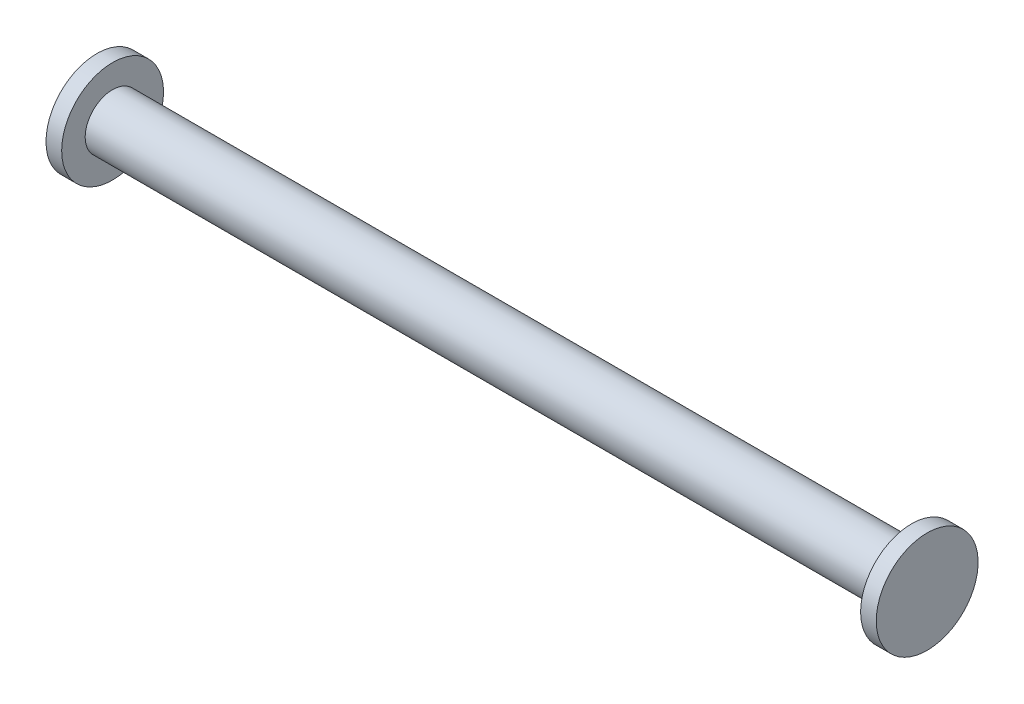
ISO-10303-21;
HEADER;
FILE_DESCRIPTION(('STEP AP214'),'2;1');
FILE_NAME('part.step','',(''),(''),'','','');
FILE_SCHEMA(('AUTOMOTIVE_DESIGN { 1 0 10303 214 1 1 1 1 }'));
ENDSEC;
DATA;
#1=APPLICATION_CONTEXT('core data for automotive mechanical design processes');
#2=APPLICATION_PROTOCOL_DEFINITION('international standard','automotive_design',2000,#1);
#3=PRODUCT_CONTEXT('',#1,'mechanical');
#4=PRODUCT('Part','Part','',(#3));
#5=PRODUCT_RELATED_PRODUCT_CATEGORY('part','',(#4));
#6=PRODUCT_DEFINITION_FORMATION('','',#4);
#7=PRODUCT_DEFINITION_CONTEXT('part definition',#1,'design');
#8=PRODUCT_DEFINITION('design','',#6,#7);
#9=PRODUCT_DEFINITION_SHAPE('','',#8);
#10=(LENGTH_UNIT() NAMED_UNIT(*) SI_UNIT(.MILLI.,.METRE.));
#11=(NAMED_UNIT(*) PLANE_ANGLE_UNIT() SI_UNIT($,.RADIAN.));
#12=(NAMED_UNIT(*) SI_UNIT($,.STERADIAN.) SOLID_ANGLE_UNIT());
#13=UNCERTAINTY_MEASURE_WITH_UNIT(LENGTH_MEASURE(1.E-05),#10,'distance_accuracy_value','');
#14=(GEOMETRIC_REPRESENTATION_CONTEXT(3) GLOBAL_UNCERTAINTY_ASSIGNED_CONTEXT((#13)) GLOBAL_UNIT_ASSIGNED_CONTEXT((#10,
#11,#12)) REPRESENTATION_CONTEXT('',''));
#15=CARTESIAN_POINT('',(0.,0.,0.));
#16=DIRECTION('',(0.,0.,1.));
#17=DIRECTION('',(1.,0.,0.));
#18=AXIS2_PLACEMENT_3D('',#15,#16,#17);
#19=CARTESIAN_POINT('',(53.,0.,0.));
#20=DIRECTION('',(-1.,0.,0.));
#21=DIRECTION('',(0.,0.,1.));
#22=AXIS2_PLACEMENT_3D('',#19,#20,#21);
#23=PLANE('',#22);
#24=CARTESIAN_POINT('',(53.,0.,0.));
#25=DIRECTION('',(-1.,0.,0.));
#26=DIRECTION('',(0.,0.,1.));
#27=AXIS2_PLACEMENT_3D('',#24,#25,#26);
#28=CIRCLE('',#27,6.5);
#29=CARTESIAN_POINT('',(53.,0.,6.5));
#30=VERTEX_POINT('',#29);
#31=EDGE_CURVE('E10',#30,#30,#28,.T.);
#32=ORIENTED_EDGE('',*,*,#31,.F.);
#33=EDGE_LOOP('',(#32));
#34=FACE_BOUND('',#33,.T.);
#35=ADVANCED_FACE('F36',(#34),#23,.F.);
#36=CARTESIAN_POINT('',(-53.,0.,0.));
#37=DIRECTION('',(-1.,0.,0.));
#38=DIRECTION('',(0.,0.,1.));
#39=AXIS2_PLACEMENT_3D('',#36,#37,#38);
#40=CYLINDRICAL_SURFACE('',#39,6.5);
#41=CARTESIAN_POINT('',(51.,0.,0.));
#42=DIRECTION('',(-1.,0.,0.));
#43=DIRECTION('',(0.,0.,1.));
#44=AXIS2_PLACEMENT_3D('',#41,#42,#43);
#45=CIRCLE('',#44,6.5);
#46=CARTESIAN_POINT('',(51.,0.,6.5));
#47=VERTEX_POINT('',#46);
#48=EDGE_CURVE('E42',#47,#47,#45,.T.);
#49=ORIENTED_EDGE('',*,*,#48,.F.);
#50=EDGE_LOOP('',(#49));
#51=FACE_BOUND('',#50,.T.);
#52=ORIENTED_EDGE('',*,*,#31,.T.);
#53=EDGE_LOOP('',(#52));
#54=FACE_BOUND('',#53,.T.);
#55=ADVANCED_FACE('F84',(#51,#54),#40,.T.);
#56=CARTESIAN_POINT('',(51.,0.,-6.5));
#57=DIRECTION('',(1.,0.,0.));
#58=DIRECTION('',(0.,0.,-1.));
#59=AXIS2_PLACEMENT_3D('',#56,#57,#58);
#60=PLANE('',#59);
#61=CARTESIAN_POINT('',(51.,0.,0.));
#62=DIRECTION('',(-1.,0.,0.));
#63=DIRECTION('',(0.,0.,1.));
#64=AXIS2_PLACEMENT_3D('',#61,#62,#63);
#65=CIRCLE('',#64,3.5);
#66=CARTESIAN_POINT('',(51.,0.,3.5));
#67=VERTEX_POINT('',#66);
#68=EDGE_CURVE('E46',#67,#67,#65,.T.);
#69=ORIENTED_EDGE('',*,*,#68,.F.);
#70=EDGE_LOOP('',(#69));
#71=FACE_BOUND('',#70,.T.);
#72=ORIENTED_EDGE('',*,*,#48,.T.);
#73=EDGE_LOOP('',(#72));
#74=FACE_BOUND('',#73,.T.);
#75=ADVANCED_FACE('F79',(#71,#74),#60,.F.);
#76=CARTESIAN_POINT('',(-53.,0.,0.));
#77=DIRECTION('',(-1.,0.,0.));
#78=DIRECTION('',(0.,0.,1.));
#79=AXIS2_PLACEMENT_3D('',#76,#77,#78);
#80=CYLINDRICAL_SURFACE('',#79,3.5);
#81=CARTESIAN_POINT('',(-51.,0.,0.));
#82=DIRECTION('',(-1.,0.,0.));
#83=DIRECTION('',(0.,0.,1.));
#84=AXIS2_PLACEMENT_3D('',#81,#82,#83);
#85=CIRCLE('',#84,3.5);
#86=CARTESIAN_POINT('',(-51.,0.,3.50000000000002));
#87=VERTEX_POINT('',#86);
#88=EDGE_CURVE('E50',#87,#87,#85,.T.);
#89=ORIENTED_EDGE('',*,*,#88,.F.);
#90=EDGE_LOOP('',(#89));
#91=FACE_BOUND('',#90,.T.);
#92=ORIENTED_EDGE('',*,*,#68,.T.);
#93=EDGE_LOOP('',(#92));
#94=FACE_BOUND('',#93,.T.);
#95=ADVANCED_FACE('F73',(#91,#94),#80,.T.);
#96=CARTESIAN_POINT('',(-51.,0.,-3.49999999999998));
#97=DIRECTION('',(-1.,0.,0.));
#98=DIRECTION('',(0.,0.,1.));
#99=AXIS2_PLACEMENT_3D('',#96,#97,#98);
#100=PLANE('',#99);
#101=CARTESIAN_POINT('',(-51.,0.,0.));
#102=DIRECTION('',(-1.,0.,0.));
#103=DIRECTION('',(0.,0.,1.));
#104=AXIS2_PLACEMENT_3D('',#101,#102,#103);
#105=CIRCLE('',#104,6.5);
#106=CARTESIAN_POINT('',(-51.,0.,6.50000000000002));
#107=VERTEX_POINT('',#106);
#108=EDGE_CURVE('E55',#107,#107,#105,.T.);
#109=ORIENTED_EDGE('',*,*,#108,.F.);
#110=EDGE_LOOP('',(#109));
#111=FACE_BOUND('',#110,.T.);
#112=ORIENTED_EDGE('',*,*,#88,.T.);
#113=EDGE_LOOP('',(#112));
#114=FACE_BOUND('',#113,.T.);
#115=ADVANCED_FACE('F67',(#111,#114),#100,.F.);
#116=CARTESIAN_POINT('',(-53.,0.,0.));
#117=DIRECTION('',(-1.,0.,0.));
#118=DIRECTION('',(0.,0.,1.));
#119=AXIS2_PLACEMENT_3D('',#116,#117,#118);
#120=CYLINDRICAL_SURFACE('',#119,6.5);
#121=CARTESIAN_POINT('',(-53.,0.,0.));
#122=DIRECTION('',(-1.,0.,0.));
#123=DIRECTION('',(0.,0.,1.));
#124=AXIS2_PLACEMENT_3D('',#121,#122,#123);
#125=CIRCLE('',#124,6.5);
#126=CARTESIAN_POINT('',(-53.,0.,6.50000000000002));
#127=VERTEX_POINT('',#126);
#128=EDGE_CURVE('E58',#127,#127,#125,.T.);
#129=ORIENTED_EDGE('',*,*,#128,.F.);
#130=EDGE_LOOP('',(#129));
#131=FACE_BOUND('',#130,.T.);
#132=ORIENTED_EDGE('',*,*,#108,.T.);
#133=EDGE_LOOP('',(#132));
#134=FACE_BOUND('',#133,.T.);
#135=ADVANCED_FACE('F64',(#131,#134),#120,.T.);
#136=CARTESIAN_POINT('',(-53.,0.,-6.49999999999998));
#137=DIRECTION('',(1.,0.,0.));
#138=DIRECTION('',(0.,0.,-1.));
#139=AXIS2_PLACEMENT_3D('',#136,#137,#138);
#140=PLANE('',#139);
#141=ORIENTED_EDGE('',*,*,#128,.T.);
#142=EDGE_LOOP('',(#141));
#143=FACE_BOUND('',#142,.T.);
#144=ADVANCED_FACE('F62',(#143),#140,.F.);
#145=CLOSED_SHELL('',(#35,#55,#75,#95,#115,#135,#144));
#146=MANIFOLD_SOLID_BREP('B2',#145);
#147=ADVANCED_BREP_SHAPE_REPRESENTATION('',(#18,#146),#14);
#148=SHAPE_DEFINITION_REPRESENTATION(#9,#147);
ENDSEC;
END-ISO-10303-21;
